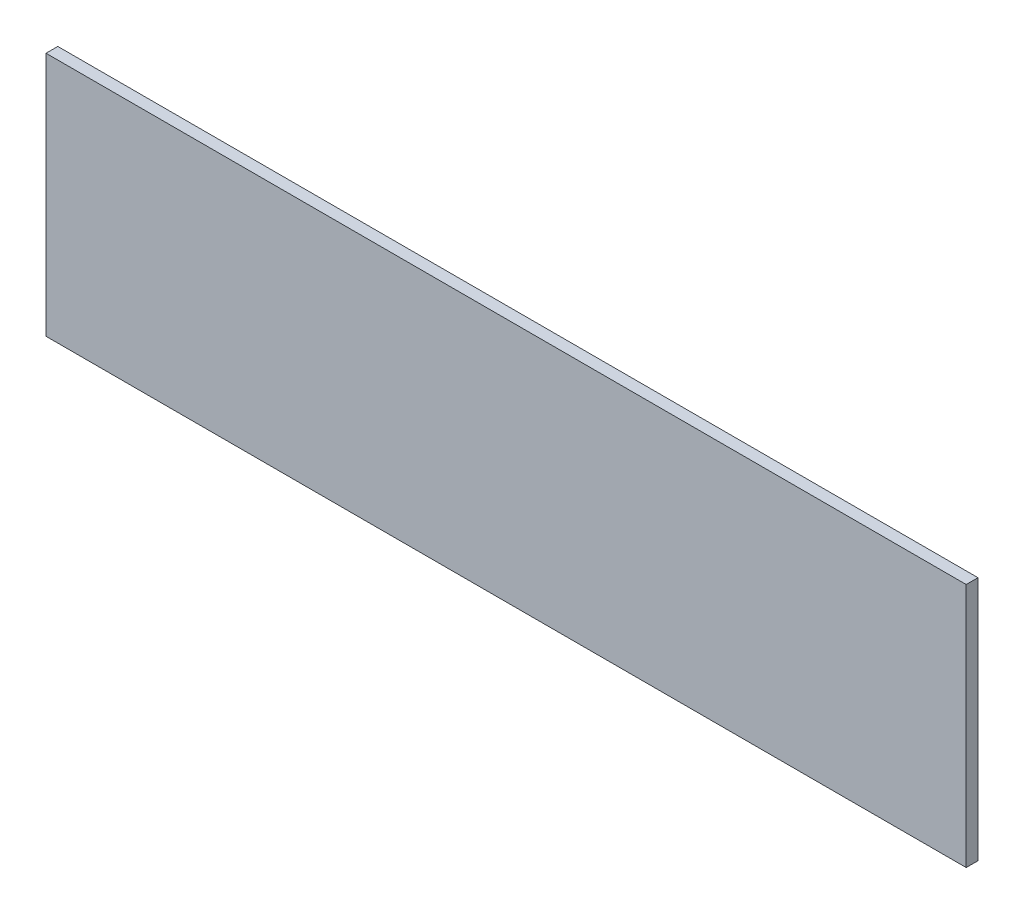
ISO-10303-21;
HEADER;
FILE_DESCRIPTION(('STEP AP214'),'2;1');
FILE_NAME('part.step','',(''),(''),'','','');
FILE_SCHEMA(('AUTOMOTIVE_DESIGN { 1 0 10303 214 1 1 1 1 }'));
ENDSEC;
DATA;
#1=APPLICATION_CONTEXT('core data for automotive mechanical design processes');
#2=APPLICATION_PROTOCOL_DEFINITION('international standard','automotive_design',2000,#1);
#3=PRODUCT_CONTEXT('',#1,'mechanical');
#4=PRODUCT('Part','Part','',(#3));
#5=PRODUCT_RELATED_PRODUCT_CATEGORY('part','',(#4));
#6=PRODUCT_DEFINITION_FORMATION('','',#4);
#7=PRODUCT_DEFINITION_CONTEXT('part definition',#1,'design');
#8=PRODUCT_DEFINITION('design','',#6,#7);
#9=PRODUCT_DEFINITION_SHAPE('','',#8);
#10=(LENGTH_UNIT() NAMED_UNIT(*) SI_UNIT(.MILLI.,.METRE.));
#11=(NAMED_UNIT(*) PLANE_ANGLE_UNIT() SI_UNIT($,.RADIAN.));
#12=(NAMED_UNIT(*) SI_UNIT($,.STERADIAN.) SOLID_ANGLE_UNIT());
#13=UNCERTAINTY_MEASURE_WITH_UNIT(LENGTH_MEASURE(1.E-05),#10,'distance_accuracy_value','');
#14=(GEOMETRIC_REPRESENTATION_CONTEXT(3) GLOBAL_UNCERTAINTY_ASSIGNED_CONTEXT((#13)) GLOBAL_UNIT_ASSIGNED_CONTEXT((#10,
#11,#12)) REPRESENTATION_CONTEXT('',''));
#15=CARTESIAN_POINT('',(0.,0.,0.));
#16=DIRECTION('',(0.,0.,1.));
#17=DIRECTION('',(1.,0.,0.));
#18=AXIS2_PLACEMENT_3D('',#15,#16,#17);
#19=CARTESIAN_POINT('',(0.,0.,0.05));
#20=DIRECTION('',(0.,0.,1.));
#21=DIRECTION('',(1.,0.,0.));
#22=AXIS2_PLACEMENT_3D('',#19,#20,#21);
#23=PLANE('',#22);
#24=DIRECTION('',(0.,1.,0.));
#25=VECTOR('',#24,1.);
#26=CARTESIAN_POINT('',(1.912,0.,0.05));
#27=LINE('',#26,#25);
#28=CARTESIAN_POINT('',(1.912,-4.238,0.05));
#29=VERTEX_POINT('',#28);
#30=CARTESIAN_POINT('',(1.912,-3.199,0.05));
#31=VERTEX_POINT('',#30);
#32=EDGE_CURVE('E20',#29,#31,#27,.T.);
#33=ORIENTED_EDGE('',*,*,#32,.T.);
#34=DIRECTION('',(1.,0.,0.));
#35=VECTOR('',#34,1.);
#36=CARTESIAN_POINT('',(1.912,-3.199,0.05));
#37=LINE('',#36,#35);
#38=CARTESIAN_POINT('',(-1.988,-3.199,0.05));
#39=VERTEX_POINT('',#38);
#40=EDGE_CURVE('E67',#39,#31,#37,.T.);
#41=ORIENTED_EDGE('',*,*,#40,.F.);
#42=DIRECTION('',(0.,1.,0.));
#43=VECTOR('',#42,1.);
#44=CARTESIAN_POINT('',(-1.988,-3.199,0.05));
#45=LINE('',#44,#43);
#46=CARTESIAN_POINT('',(-1.988,-4.238,0.05));
#47=VERTEX_POINT('',#46);
#48=EDGE_CURVE('E58',#47,#39,#45,.T.);
#49=ORIENTED_EDGE('',*,*,#48,.F.);
#50=DIRECTION('',(1.,0.,0.));
#51=VECTOR('',#50,1.);
#52=CARTESIAN_POINT('',(-1.988,-4.238,0.05));
#53=LINE('',#52,#51);
#54=EDGE_CURVE('E53',#29,#47,#53,.F.);
#55=ORIENTED_EDGE('',*,*,#54,.F.);
#56=EDGE_LOOP('',(#33,#41,#49,#55));
#57=FACE_BOUND('',#56,.T.);
#58=ADVANCED_FACE('F17',(#57),#23,.T.);
#59=CARTESIAN_POINT('',(1.912,-3.199,0.));
#60=DIRECTION('',(0.,1.,0.));
#61=DIRECTION('',(0.,0.,1.));
#62=AXIS2_PLACEMENT_3D('',#59,#60,#61);
#63=PLANE('',#62);
#64=DIRECTION('',(0.,0.,-1.));
#65=VECTOR('',#64,1.);
#66=CARTESIAN_POINT('',(1.912,-3.199,0.));
#67=LINE('',#66,#65);
#68=CARTESIAN_POINT('',(1.912,-3.199,0.));
#69=VERTEX_POINT('',#68);
#70=EDGE_CURVE('E80',#69,#31,#67,.F.);
#71=ORIENTED_EDGE('',*,*,#70,.F.);
#72=DIRECTION('',(1.,0.,0.));
#73=VECTOR('',#72,1.);
#74=CARTESIAN_POINT('',(0.,-3.199,0.));
#75=LINE('',#74,#73);
#76=CARTESIAN_POINT('',(-1.988,-3.199,0.));
#77=VERTEX_POINT('',#76);
#78=EDGE_CURVE('E75',#69,#77,#75,.F.);
#79=ORIENTED_EDGE('',*,*,#78,.T.);
#80=DIRECTION('',(0.,0.,1.));
#81=VECTOR('',#80,1.);
#82=CARTESIAN_POINT('',(-1.988,-3.199,0.));
#83=LINE('',#82,#81);
#84=EDGE_CURVE('E63',#39,#77,#83,.F.);
#85=ORIENTED_EDGE('',*,*,#84,.F.);
#86=ORIENTED_EDGE('',*,*,#40,.T.);
#87=EDGE_LOOP('',(#71,#79,#85,#86));
#88=FACE_BOUND('',#87,.T.);
#89=ADVANCED_FACE('F74',(#88),#63,.T.);
#90=CARTESIAN_POINT('',(-1.988,-3.199,0.));
#91=DIRECTION('',(-1.,0.,0.));
#92=DIRECTION('',(0.,0.,1.));
#93=AXIS2_PLACEMENT_3D('',#90,#91,#92);
#94=PLANE('',#93);
#95=ORIENTED_EDGE('',*,*,#84,.T.);
#96=DIRECTION('',(0.,1.,0.));
#97=VECTOR('',#96,1.);
#98=CARTESIAN_POINT('',(-1.988,0.,0.));
#99=LINE('',#98,#97);
#100=CARTESIAN_POINT('',(-1.988,-4.238,0.));
#101=VERTEX_POINT('',#100);
#102=EDGE_CURVE('E84',#77,#101,#99,.F.);
#103=ORIENTED_EDGE('',*,*,#102,.T.);
#104=DIRECTION('',(0.,0.,-1.));
#105=VECTOR('',#104,1.);
#106=CARTESIAN_POINT('',(-1.988,-4.238,0.));
#107=LINE('',#106,#105);
#108=EDGE_CURVE('E65',#47,#101,#107,.T.);
#109=ORIENTED_EDGE('',*,*,#108,.F.);
#110=ORIENTED_EDGE('',*,*,#48,.T.);
#111=EDGE_LOOP('',(#95,#103,#109,#110));
#112=FACE_BOUND('',#111,.T.);
#113=ADVANCED_FACE('F60',(#112),#94,.T.);
#114=CARTESIAN_POINT('',(-1.988,-4.238,0.));
#115=DIRECTION('',(0.,-1.,0.));
#116=DIRECTION('',(0.,0.,-1.));
#117=AXIS2_PLACEMENT_3D('',#114,#115,#116);
#118=PLANE('',#117);
#119=ORIENTED_EDGE('',*,*,#108,.T.);
#120=DIRECTION('',(1.,0.,0.));
#121=VECTOR('',#120,1.);
#122=CARTESIAN_POINT('',(0.,-4.238,0.));
#123=LINE('',#122,#121);
#124=CARTESIAN_POINT('',(1.912,-4.238,0.));
#125=VERTEX_POINT('',#124);
#126=EDGE_CURVE('E26',#101,#125,#123,.T.);
#127=ORIENTED_EDGE('',*,*,#126,.T.);
#128=DIRECTION('',(0.,0.,-1.));
#129=VECTOR('',#128,1.);
#130=CARTESIAN_POINT('',(1.912,-4.238,0.));
#131=LINE('',#130,#129);
#132=EDGE_CURVE('E34',#29,#125,#131,.T.);
#133=ORIENTED_EDGE('',*,*,#132,.F.);
#134=ORIENTED_EDGE('',*,*,#54,.T.);
#135=EDGE_LOOP('',(#119,#127,#133,#134));
#136=FACE_BOUND('',#135,.T.);
#137=ADVANCED_FACE('F88',(#136),#118,.T.);
#138=CARTESIAN_POINT('',(1.912,-4.238,0.));
#139=DIRECTION('',(1.,0.,0.));
#140=DIRECTION('',(0.,0.,-1.));
#141=AXIS2_PLACEMENT_3D('',#138,#139,#140);
#142=PLANE('',#141);
#143=ORIENTED_EDGE('',*,*,#132,.T.);
#144=DIRECTION('',(0.,1.,0.));
#145=VECTOR('',#144,1.);
#146=CARTESIAN_POINT('',(1.912,0.,0.));
#147=LINE('',#146,#145);
#148=EDGE_CURVE('E11',#125,#69,#147,.T.);
#149=ORIENTED_EDGE('',*,*,#148,.T.);
#150=ORIENTED_EDGE('',*,*,#70,.T.);
#151=ORIENTED_EDGE('',*,*,#32,.F.);
#152=EDGE_LOOP('',(#143,#149,#150,#151));
#153=FACE_BOUND('',#152,.T.);
#154=ADVANCED_FACE('F91',(#153),#142,.T.);
#155=CARTESIAN_POINT('',(0.,0.,0.));
#156=DIRECTION('',(0.,0.,1.));
#157=DIRECTION('',(1.,0.,0.));
#158=AXIS2_PLACEMENT_3D('',#155,#156,#157);
#159=PLANE('',#158);
#160=ORIENTED_EDGE('',*,*,#126,.F.);
#161=ORIENTED_EDGE('',*,*,#102,.F.);
#162=ORIENTED_EDGE('',*,*,#78,.F.);
#163=ORIENTED_EDGE('',*,*,#148,.F.);
#164=EDGE_LOOP('',(#160,#161,#162,#163));
#165=FACE_BOUND('',#164,.T.);
#166=ADVANCED_FACE('F90',(#165),#159,.F.);
#167=CLOSED_SHELL('',(#58,#89,#113,#137,#154,#166));
#168=MANIFOLD_SOLID_BREP('B1',#167);
#169=ADVANCED_BREP_SHAPE_REPRESENTATION('',(#18,#168),#14);
#170=SHAPE_DEFINITION_REPRESENTATION(#9,#169);
ENDSEC;
END-ISO-10303-21;
